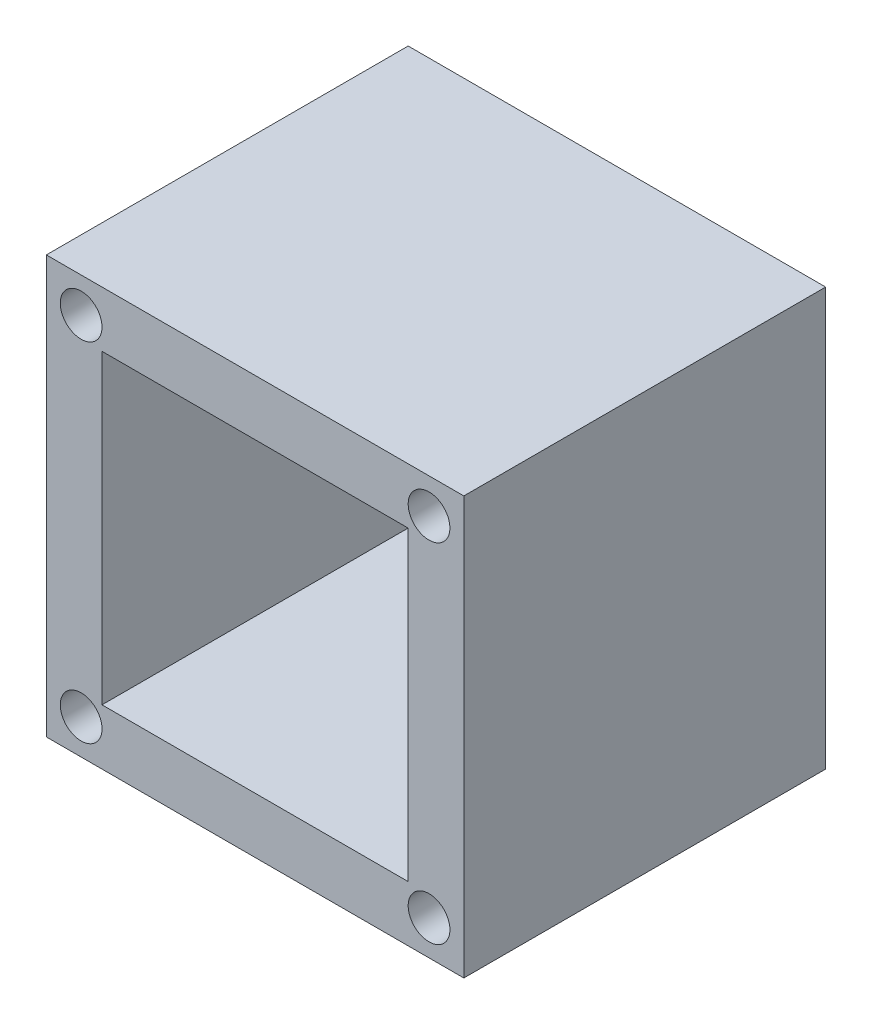
ISO-10303-21;
HEADER;
FILE_DESCRIPTION(('STEP AP214'),'2;1');
FILE_NAME('part.step','',(''),(''),'','','');
FILE_SCHEMA(('AUTOMOTIVE_DESIGN { 1 0 10303 214 1 1 1 1 }'));
ENDSEC;
DATA;
#1=APPLICATION_CONTEXT('core data for automotive mechanical design processes');
#2=APPLICATION_PROTOCOL_DEFINITION('international standard','automotive_design',2000,#1);
#3=PRODUCT_CONTEXT('',#1,'mechanical');
#4=PRODUCT('Part','Part','',(#3));
#5=PRODUCT_RELATED_PRODUCT_CATEGORY('part','',(#4));
#6=PRODUCT_DEFINITION_FORMATION('','',#4);
#7=PRODUCT_DEFINITION_CONTEXT('part definition',#1,'design');
#8=PRODUCT_DEFINITION('design','',#6,#7);
#9=PRODUCT_DEFINITION_SHAPE('','',#8);
#10=(LENGTH_UNIT() NAMED_UNIT(*) SI_UNIT(.MILLI.,.METRE.));
#11=(NAMED_UNIT(*) PLANE_ANGLE_UNIT() SI_UNIT($,.RADIAN.));
#12=(NAMED_UNIT(*) SI_UNIT($,.STERADIAN.) SOLID_ANGLE_UNIT());
#13=UNCERTAINTY_MEASURE_WITH_UNIT(LENGTH_MEASURE(1.E-05),#10,'distance_accuracy_value','');
#14=(GEOMETRIC_REPRESENTATION_CONTEXT(3) GLOBAL_UNCERTAINTY_ASSIGNED_CONTEXT((#13)) GLOBAL_UNIT_ASSIGNED_CONTEXT((#10,
#11,#12)) REPRESENTATION_CONTEXT('',''));
#15=CARTESIAN_POINT('',(0.,0.,0.));
#16=DIRECTION('',(0.,0.,1.));
#17=DIRECTION('',(1.,0.,0.));
#18=AXIS2_PLACEMENT_3D('',#15,#16,#17);
#19=CARTESIAN_POINT('',(-15.,15.,-0.999999999999993));
#20=DIRECTION('',(0.,1.,0.));
#21=DIRECTION('',(0.,0.,1.));
#22=AXIS2_PLACEMENT_3D('',#19,#20,#21);
#23=PLANE('',#22);
#24=DIRECTION('',(0.,0.,1.));
#25=VECTOR('',#24,1.);
#26=CARTESIAN_POINT('',(15.,15.,-0.999999999999993));
#27=LINE('',#26,#25);
#28=CARTESIAN_POINT('',(15.,15.,4.00000000000001));
#29=VERTEX_POINT('',#28);
#30=CARTESIAN_POINT('',(15.,15.,30.));
#31=VERTEX_POINT('',#30);
#32=EDGE_CURVE('E48',#29,#31,#27,.T.);
#33=ORIENTED_EDGE('',*,*,#32,.F.);
#34=DIRECTION('',(-1.,0.,0.));
#35=VECTOR('',#34,1.);
#36=CARTESIAN_POINT('',(31.,15.,4.00000000000001));
#37=LINE('',#36,#35);
#38=CARTESIAN_POINT('',(-15.,15.,4.00000000000001));
#39=VERTEX_POINT('',#38);
#40=EDGE_CURVE('E57',#29,#39,#37,.T.);
#41=ORIENTED_EDGE('',*,*,#40,.T.);
#42=DIRECTION('',(0.,0.,1.));
#43=VECTOR('',#42,1.);
#44=CARTESIAN_POINT('',(-15.,15.,-0.999999999999993));
#45=LINE('',#44,#43);
#46=CARTESIAN_POINT('',(-15.,15.,30.));
#47=VERTEX_POINT('',#46);
#48=EDGE_CURVE('E11',#39,#47,#45,.T.);
#49=ORIENTED_EDGE('',*,*,#48,.T.);
#50=DIRECTION('',(-1.,0.,0.));
#51=VECTOR('',#50,1.);
#52=CARTESIAN_POINT('',(-15.,15.,30.));
#53=LINE('',#52,#51);
#54=EDGE_CURVE('E124',#31,#47,#53,.T.);
#55=ORIENTED_EDGE('',*,*,#54,.F.);
#56=EDGE_LOOP('',(#33,#41,#49,#55));
#57=FACE_BOUND('',#56,.T.);
#58=ADVANCED_FACE('F39',(#57),#23,.T.);
#59=CARTESIAN_POINT('',(-15.,15.,-0.999999999999993));
#60=DIRECTION('',(-1.,0.,0.));
#61=DIRECTION('',(0.,-1.,0.));
#62=AXIS2_PLACEMENT_3D('',#59,#60,#61);
#63=PLANE('',#62);
#64=DIRECTION('',(0.,1.,0.));
#65=VECTOR('',#64,1.);
#66=CARTESIAN_POINT('',(-15.,15.,4.00000000000001));
#67=LINE('',#66,#65);
#68=CARTESIAN_POINT('',(-15.,-15.,4.00000000000001));
#69=VERTEX_POINT('',#68);
#70=EDGE_CURVE('E106',#69,#39,#67,.T.);
#71=ORIENTED_EDGE('',*,*,#70,.F.);
#72=DIRECTION('',(0.,0.,1.));
#73=VECTOR('',#72,1.);
#74=CARTESIAN_POINT('',(-15.,-15.,-0.999999999999993));
#75=LINE('',#74,#73);
#76=CARTESIAN_POINT('',(-15.,-15.,30.));
#77=VERTEX_POINT('',#76);
#78=EDGE_CURVE('E114',#69,#77,#75,.T.);
#79=ORIENTED_EDGE('',*,*,#78,.T.);
#80=DIRECTION('',(0.,-1.,0.));
#81=VECTOR('',#80,1.);
#82=CARTESIAN_POINT('',(-15.,15.,30.));
#83=LINE('',#82,#81);
#84=EDGE_CURVE('E134',#47,#77,#83,.T.);
#85=ORIENTED_EDGE('',*,*,#84,.F.);
#86=ORIENTED_EDGE('',*,*,#48,.F.);
#87=EDGE_LOOP('',(#71,#79,#85,#86));
#88=FACE_BOUND('',#87,.T.);
#89=ADVANCED_FACE('F41',(#88),#63,.T.);
#90=CARTESIAN_POINT('',(15.,15.,-0.999999999999993));
#91=DIRECTION('',(1.,0.,0.));
#92=DIRECTION('',(0.,0.,-1.));
#93=AXIS2_PLACEMENT_3D('',#90,#91,#92);
#94=PLANE('',#93);
#95=DIRECTION('',(0.,-1.,0.));
#96=VECTOR('',#95,1.);
#97=CARTESIAN_POINT('',(15.,15.,4.00000000000001));
#98=LINE('',#97,#96);
#99=CARTESIAN_POINT('',(15.,-15.,4.00000000000001));
#100=VERTEX_POINT('',#99);
#101=EDGE_CURVE('E110',#29,#100,#98,.T.);
#102=ORIENTED_EDGE('',*,*,#101,.F.);
#103=ORIENTED_EDGE('',*,*,#32,.T.);
#104=DIRECTION('',(0.,1.,0.));
#105=VECTOR('',#104,1.);
#106=CARTESIAN_POINT('',(15.,15.,30.));
#107=LINE('',#106,#105);
#108=CARTESIAN_POINT('',(15.,-15.,30.));
#109=VERTEX_POINT('',#108);
#110=EDGE_CURVE('E128',#109,#31,#107,.T.);
#111=ORIENTED_EDGE('',*,*,#110,.F.);
#112=DIRECTION('',(0.,0.,1.));
#113=VECTOR('',#112,1.);
#114=CARTESIAN_POINT('',(15.,-15.,-0.999999999999993));
#115=LINE('',#114,#113);
#116=EDGE_CURVE('E125',#100,#109,#115,.T.);
#117=ORIENTED_EDGE('',*,*,#116,.F.);
#118=EDGE_LOOP('',(#102,#103,#111,#117));
#119=FACE_BOUND('',#118,.T.);
#120=ADVANCED_FACE('F243',(#119),#94,.T.);
#121=CARTESIAN_POINT('',(-15.,-15.,-0.999999999999993));
#122=DIRECTION('',(0.,-1.,0.));
#123=DIRECTION('',(0.,0.,-1.));
#124=AXIS2_PLACEMENT_3D('',#121,#122,#123);
#125=PLANE('',#124);
#126=DIRECTION('',(-1.,0.,0.));
#127=VECTOR('',#126,1.);
#128=CARTESIAN_POINT('',(31.,-15.,4.00000000000001));
#129=LINE('',#128,#127);
#130=EDGE_CURVE('E101',#100,#69,#129,.T.);
#131=ORIENTED_EDGE('',*,*,#130,.F.);
#132=ORIENTED_EDGE('',*,*,#116,.T.);
#133=DIRECTION('',(1.,0.,0.));
#134=VECTOR('',#133,1.);
#135=CARTESIAN_POINT('',(-15.,-15.,30.));
#136=LINE('',#135,#134);
#137=EDGE_CURVE('E119',#77,#109,#136,.T.);
#138=ORIENTED_EDGE('',*,*,#137,.F.);
#139=ORIENTED_EDGE('',*,*,#78,.F.);
#140=EDGE_LOOP('',(#131,#132,#138,#139));
#141=FACE_BOUND('',#140,.T.);
#142=ADVANCED_FACE('F117',(#141),#125,.T.);
#143=CARTESIAN_POINT('',(0.,0.,30.));
#144=DIRECTION('',(0.,0.,1.));
#145=DIRECTION('',(1.,0.,0.));
#146=AXIS2_PLACEMENT_3D('',#143,#144,#145);
#147=PLANE('',#146);
#148=CARTESIAN_POINT('',(-12.5,-12.5,30.));
#149=DIRECTION('',(0.,0.,1.));
#150=DIRECTION('',(-1.,0.,0.));
#151=AXIS2_PLACEMENT_3D('',#148,#149,#150);
#152=CIRCLE('',#151,1.5);
#153=CARTESIAN_POINT('',(-14.,-12.5,30.));
#154=VERTEX_POINT('',#153);
#155=EDGE_CURVE('E159',#154,#154,#152,.T.);
#156=ORIENTED_EDGE('',*,*,#155,.F.);
#157=EDGE_LOOP('',(#156));
#158=FACE_BOUND('',#157,.T.);
#159=CARTESIAN_POINT('',(12.5,-12.5,30.));
#160=DIRECTION('',(0.,0.,1.));
#161=DIRECTION('',(1.,0.,0.));
#162=AXIS2_PLACEMENT_3D('',#159,#160,#161);
#163=CIRCLE('',#162,1.5);
#164=CARTESIAN_POINT('',(14.,-12.5,30.));
#165=VERTEX_POINT('',#164);
#166=EDGE_CURVE('E161',#165,#165,#163,.T.);
#167=ORIENTED_EDGE('',*,*,#166,.F.);
#168=EDGE_LOOP('',(#167));
#169=FACE_BOUND('',#168,.T.);
#170=CARTESIAN_POINT('',(12.5,12.5,30.));
#171=DIRECTION('',(0.,0.,1.));
#172=DIRECTION('',(-1.,0.,0.));
#173=AXIS2_PLACEMENT_3D('',#170,#171,#172);
#174=CIRCLE('',#173,1.5);
#175=CARTESIAN_POINT('',(11.,12.5,30.));
#176=VERTEX_POINT('',#175);
#177=EDGE_CURVE('E157',#176,#176,#174,.T.);
#178=ORIENTED_EDGE('',*,*,#177,.F.);
#179=EDGE_LOOP('',(#178));
#180=FACE_BOUND('',#179,.T.);
#181=CARTESIAN_POINT('',(-12.5,12.5,30.));
#182=DIRECTION('',(0.,0.,1.));
#183=DIRECTION('',(1.,0.,0.));
#184=AXIS2_PLACEMENT_3D('',#181,#182,#183);
#185=CIRCLE('',#184,1.5);
#186=CARTESIAN_POINT('',(-11.,12.5,30.));
#187=VERTEX_POINT('',#186);
#188=EDGE_CURVE('E156',#187,#187,#185,.T.);
#189=ORIENTED_EDGE('',*,*,#188,.F.);
#190=EDGE_LOOP('',(#189));
#191=FACE_BOUND('',#190,.T.);
#192=ORIENTED_EDGE('',*,*,#84,.T.);
#193=ORIENTED_EDGE('',*,*,#137,.T.);
#194=ORIENTED_EDGE('',*,*,#110,.T.);
#195=ORIENTED_EDGE('',*,*,#54,.T.);
#196=EDGE_LOOP('',(#192,#193,#194,#195));
#197=FACE_BOUND('',#196,.T.);
#198=DIRECTION('',(1.,0.,0.));
#199=VECTOR('',#198,1.);
#200=CARTESIAN_POINT('',(-11.,-11.,30.));
#201=LINE('',#200,#199);
#202=CARTESIAN_POINT('',(-11.,-11.,30.));
#203=VERTEX_POINT('',#202);
#204=CARTESIAN_POINT('',(11.,-11.,30.));
#205=VERTEX_POINT('',#204);
#206=EDGE_CURVE('E152',#203,#205,#201,.T.);
#207=ORIENTED_EDGE('',*,*,#206,.F.);
#208=DIRECTION('',(0.,-1.,0.));
#209=VECTOR('',#208,1.);
#210=CARTESIAN_POINT('',(-11.,11.,30.));
#211=LINE('',#210,#209);
#212=CARTESIAN_POINT('',(-11.,11.,30.));
#213=VERTEX_POINT('',#212);
#214=EDGE_CURVE('E153',#213,#203,#211,.T.);
#215=ORIENTED_EDGE('',*,*,#214,.F.);
#216=DIRECTION('',(-1.,0.,0.));
#217=VECTOR('',#216,1.);
#218=CARTESIAN_POINT('',(-11.,11.,30.));
#219=LINE('',#218,#217);
#220=CARTESIAN_POINT('',(11.,11.,30.));
#221=VERTEX_POINT('',#220);
#222=EDGE_CURVE('E149',#221,#213,#219,.T.);
#223=ORIENTED_EDGE('',*,*,#222,.F.);
#224=DIRECTION('',(0.,1.,0.));
#225=VECTOR('',#224,1.);
#226=CARTESIAN_POINT('',(11.,11.,30.));
#227=LINE('',#226,#225);
#228=EDGE_CURVE('E150',#205,#221,#227,.T.);
#229=ORIENTED_EDGE('',*,*,#228,.F.);
#230=EDGE_LOOP('',(#207,#215,#223,#229));
#231=FACE_BOUND('',#230,.T.);
#232=ADVANCED_FACE('F206',(#158,#169,#180,#191,#197,#231),#147,.T.);
#233=CARTESIAN_POINT('',(-11.,11.,30.));
#234=DIRECTION('',(1.,0.,0.));
#235=DIRECTION('',(0.,1.,0.));
#236=AXIS2_PLACEMENT_3D('',#233,#234,#235);
#237=PLANE('',#236);
#238=DIRECTION('',(0.,-1.,0.));
#239=VECTOR('',#238,1.);
#240=CARTESIAN_POINT('',(-11.,11.,4.00000000000001));
#241=LINE('',#240,#239);
#242=CARTESIAN_POINT('',(-11.,11.,4.00000000000001));
#243=VERTEX_POINT('',#242);
#244=CARTESIAN_POINT('',(-11.,-11.,4.00000000000001));
#245=VERTEX_POINT('',#244);
#246=EDGE_CURVE('E169',#243,#245,#241,.T.);
#247=ORIENTED_EDGE('',*,*,#246,.F.);
#248=DIRECTION('',(0.,0.,-1.));
#249=VECTOR('',#248,1.);
#250=CARTESIAN_POINT('',(-11.,11.,30.));
#251=LINE('',#250,#249);
#252=EDGE_CURVE('E144',#213,#243,#251,.T.);
#253=ORIENTED_EDGE('',*,*,#252,.F.);
#254=ORIENTED_EDGE('',*,*,#214,.T.);
#255=DIRECTION('',(0.,0.,-1.));
#256=VECTOR('',#255,1.);
#257=CARTESIAN_POINT('',(-11.,-11.,30.));
#258=LINE('',#257,#256);
#259=EDGE_CURVE('E135',#203,#245,#258,.T.);
#260=ORIENTED_EDGE('',*,*,#259,.T.);
#261=EDGE_LOOP('',(#247,#253,#254,#260));
#262=FACE_BOUND('',#261,.T.);
#263=ADVANCED_FACE('F213',(#262),#237,.T.);
#264=CARTESIAN_POINT('',(-11.,-11.,30.));
#265=DIRECTION('',(0.,1.,0.));
#266=DIRECTION('',(0.,0.,1.));
#267=AXIS2_PLACEMENT_3D('',#264,#265,#266);
#268=PLANE('',#267);
#269=DIRECTION('',(1.,0.,0.));
#270=VECTOR('',#269,1.);
#271=CARTESIAN_POINT('',(-11.,-11.,4.00000000000001));
#272=LINE('',#271,#270);
#273=CARTESIAN_POINT('',(11.,-11.,4.00000000000001));
#274=VERTEX_POINT('',#273);
#275=EDGE_CURVE('E171',#245,#274,#272,.T.);
#276=ORIENTED_EDGE('',*,*,#275,.F.);
#277=ORIENTED_EDGE('',*,*,#259,.F.);
#278=ORIENTED_EDGE('',*,*,#206,.T.);
#279=DIRECTION('',(0.,0.,-1.));
#280=VECTOR('',#279,1.);
#281=CARTESIAN_POINT('',(11.,-11.,30.));
#282=LINE('',#281,#280);
#283=EDGE_CURVE('E138',#205,#274,#282,.T.);
#284=ORIENTED_EDGE('',*,*,#283,.T.);
#285=EDGE_LOOP('',(#276,#277,#278,#284));
#286=FACE_BOUND('',#285,.T.);
#287=ADVANCED_FACE('F223',(#286),#268,.T.);
#288=CARTESIAN_POINT('',(11.,11.,30.));
#289=DIRECTION('',(-1.,0.,0.));
#290=DIRECTION('',(0.,-1.,0.));
#291=AXIS2_PLACEMENT_3D('',#288,#289,#290);
#292=PLANE('',#291);
#293=DIRECTION('',(0.,1.,0.));
#294=VECTOR('',#293,1.);
#295=CARTESIAN_POINT('',(11.,11.,4.00000000000001));
#296=LINE('',#295,#294);
#297=CARTESIAN_POINT('',(11.,11.,4.00000000000001));
#298=VERTEX_POINT('',#297);
#299=EDGE_CURVE('E65',#274,#298,#296,.T.);
#300=ORIENTED_EDGE('',*,*,#299,.F.);
#301=ORIENTED_EDGE('',*,*,#283,.F.);
#302=ORIENTED_EDGE('',*,*,#228,.T.);
#303=DIRECTION('',(0.,0.,-1.));
#304=VECTOR('',#303,1.);
#305=CARTESIAN_POINT('',(11.,11.,30.));
#306=LINE('',#305,#304);
#307=EDGE_CURVE('E142',#221,#298,#306,.T.);
#308=ORIENTED_EDGE('',*,*,#307,.T.);
#309=EDGE_LOOP('',(#300,#301,#302,#308));
#310=FACE_BOUND('',#309,.T.);
#311=ADVANCED_FACE('F224',(#310),#292,.T.);
#312=CARTESIAN_POINT('',(-11.,11.,30.));
#313=DIRECTION('',(0.,-1.,0.));
#314=DIRECTION('',(0.,0.,-1.));
#315=AXIS2_PLACEMENT_3D('',#312,#313,#314);
#316=PLANE('',#315);
#317=DIRECTION('',(-1.,0.,0.));
#318=VECTOR('',#317,1.);
#319=CARTESIAN_POINT('',(-11.,11.,4.00000000000001));
#320=LINE('',#319,#318);
#321=EDGE_CURVE('E172',#298,#243,#320,.T.);
#322=ORIENTED_EDGE('',*,*,#321,.F.);
#323=ORIENTED_EDGE('',*,*,#307,.F.);
#324=ORIENTED_EDGE('',*,*,#222,.T.);
#325=ORIENTED_EDGE('',*,*,#252,.T.);
#326=EDGE_LOOP('',(#322,#323,#324,#325));
#327=FACE_BOUND('',#326,.T.);
#328=ADVANCED_FACE('F202',(#327),#316,.T.);
#329=CARTESIAN_POINT('',(-12.5,12.5,-14.));
#330=DIRECTION('',(0.,0.,1.));
#331=DIRECTION('',(1.,0.,0.));
#332=AXIS2_PLACEMENT_3D('',#329,#330,#331);
#333=CYLINDRICAL_SURFACE('',#332,1.5);
#334=CARTESIAN_POINT('',(-12.5,12.5,4.00000000000001));
#335=DIRECTION('',(0.,0.,1.));
#336=DIRECTION('',(0.,-1.,0.));
#337=AXIS2_PLACEMENT_3D('',#334,#335,#336);
#338=CIRCLE('',#337,1.5);
#339=CARTESIAN_POINT('',(-12.5,11.,4.00000000000001));
#340=VERTEX_POINT('',#339);
#341=EDGE_CURVE('E176',#340,#340,#338,.F.);
#342=ORIENTED_EDGE('',*,*,#341,.T.);
#343=EDGE_LOOP('',(#342));
#344=FACE_BOUND('',#343,.T.);
#345=ORIENTED_EDGE('',*,*,#188,.T.);
#346=EDGE_LOOP('',(#345));
#347=FACE_BOUND('',#346,.T.);
#348=ADVANCED_FACE('F200',(#344,#347),#333,.F.);
#349=CARTESIAN_POINT('',(12.5,12.5,-14.));
#350=DIRECTION('',(0.,0.,1.));
#351=DIRECTION('',(1.,0.,0.));
#352=AXIS2_PLACEMENT_3D('',#349,#350,#351);
#353=CYLINDRICAL_SURFACE('',#352,1.5);
#354=CARTESIAN_POINT('',(12.5,12.5,4.00000000000001));
#355=DIRECTION('',(0.,0.,1.));
#356=DIRECTION('',(0.,-1.,0.));
#357=AXIS2_PLACEMENT_3D('',#354,#355,#356);
#358=CIRCLE('',#357,1.5);
#359=CARTESIAN_POINT('',(12.5,11.,4.00000000000001));
#360=VERTEX_POINT('',#359);
#361=EDGE_CURVE('E177',#360,#360,#358,.F.);
#362=ORIENTED_EDGE('',*,*,#361,.T.);
#363=EDGE_LOOP('',(#362));
#364=FACE_BOUND('',#363,.T.);
#365=ORIENTED_EDGE('',*,*,#177,.T.);
#366=EDGE_LOOP('',(#365));
#367=FACE_BOUND('',#366,.T.);
#368=ADVANCED_FACE('F203',(#364,#367),#353,.F.);
#369=CARTESIAN_POINT('',(12.5,-12.5,-14.));
#370=DIRECTION('',(0.,0.,1.));
#371=DIRECTION('',(1.,0.,0.));
#372=AXIS2_PLACEMENT_3D('',#369,#370,#371);
#373=CYLINDRICAL_SURFACE('',#372,1.5);
#374=CARTESIAN_POINT('',(12.5,-12.5,4.00000000000001));
#375=DIRECTION('',(0.,0.,1.));
#376=DIRECTION('',(0.,-1.,0.));
#377=AXIS2_PLACEMENT_3D('',#374,#375,#376);
#378=CIRCLE('',#377,1.5);
#379=CARTESIAN_POINT('',(12.5,-14.,4.00000000000001));
#380=VERTEX_POINT('',#379);
#381=EDGE_CURVE('E185',#380,#380,#378,.F.);
#382=ORIENTED_EDGE('',*,*,#381,.T.);
#383=EDGE_LOOP('',(#382));
#384=FACE_BOUND('',#383,.T.);
#385=ORIENTED_EDGE('',*,*,#166,.T.);
#386=EDGE_LOOP('',(#385));
#387=FACE_BOUND('',#386,.T.);
#388=ADVANCED_FACE('F315',(#384,#387),#373,.F.);
#389=CARTESIAN_POINT('',(-12.5,-12.5,-14.));
#390=DIRECTION('',(0.,0.,1.));
#391=DIRECTION('',(1.,0.,0.));
#392=AXIS2_PLACEMENT_3D('',#389,#390,#391);
#393=CYLINDRICAL_SURFACE('',#392,1.5);
#394=CARTESIAN_POINT('',(-12.5,-12.5,4.00000000000001));
#395=DIRECTION('',(0.,0.,1.));
#396=DIRECTION('',(0.,-1.,0.));
#397=AXIS2_PLACEMENT_3D('',#394,#395,#396);
#398=CIRCLE('',#397,1.5);
#399=CARTESIAN_POINT('',(-12.5,-14.,4.00000000000001));
#400=VERTEX_POINT('',#399);
#401=EDGE_CURVE('E43',#400,#400,#398,.F.);
#402=ORIENTED_EDGE('',*,*,#401,.T.);
#403=EDGE_LOOP('',(#402));
#404=FACE_BOUND('',#403,.T.);
#405=ORIENTED_EDGE('',*,*,#155,.T.);
#406=EDGE_LOOP('',(#405));
#407=FACE_BOUND('',#406,.T.);
#408=ADVANCED_FACE('F188',(#404,#407),#393,.F.);
#409=CARTESIAN_POINT('',(31.,15.,4.00000000000001));
#410=DIRECTION('',(0.,0.,1.));
#411=DIRECTION('',(0.,-1.,0.));
#412=AXIS2_PLACEMENT_3D('',#409,#410,#411);
#413=PLANE('',#412);
#414=ORIENTED_EDGE('',*,*,#101,.T.);
#415=ORIENTED_EDGE('',*,*,#130,.T.);
#416=ORIENTED_EDGE('',*,*,#70,.T.);
#417=ORIENTED_EDGE('',*,*,#40,.F.);
#418=EDGE_LOOP('',(#414,#415,#416,#417));
#419=FACE_BOUND('',#418,.T.);
#420=ORIENTED_EDGE('',*,*,#246,.T.);
#421=ORIENTED_EDGE('',*,*,#275,.T.);
#422=ORIENTED_EDGE('',*,*,#299,.T.);
#423=ORIENTED_EDGE('',*,*,#321,.T.);
#424=EDGE_LOOP('',(#420,#421,#422,#423));
#425=FACE_BOUND('',#424,.T.);
#426=ORIENTED_EDGE('',*,*,#361,.F.);
#427=EDGE_LOOP('',(#426));
#428=FACE_BOUND('',#427,.T.);
#429=ORIENTED_EDGE('',*,*,#401,.F.);
#430=EDGE_LOOP('',(#429));
#431=FACE_BOUND('',#430,.T.);
#432=ORIENTED_EDGE('',*,*,#381,.F.);
#433=EDGE_LOOP('',(#432));
#434=FACE_BOUND('',#433,.T.);
#435=ORIENTED_EDGE('',*,*,#341,.F.);
#436=EDGE_LOOP('',(#435));
#437=FACE_BOUND('',#436,.T.);
#438=ADVANCED_FACE('F102',(#419,#425,#428,#431,#434,#437),#413,.F.);
#439=CLOSED_SHELL('',(#58,#89,#120,#142,#232,#263,#287,#311,#328,#348,#368,#388,#408,#438));
#440=MANIFOLD_SOLID_BREP('B2',#439);
#441=ADVANCED_BREP_SHAPE_REPRESENTATION('',(#18,#440),#14);
#442=SHAPE_DEFINITION_REPRESENTATION(#9,#441);
ENDSEC;
END-ISO-10303-21;
